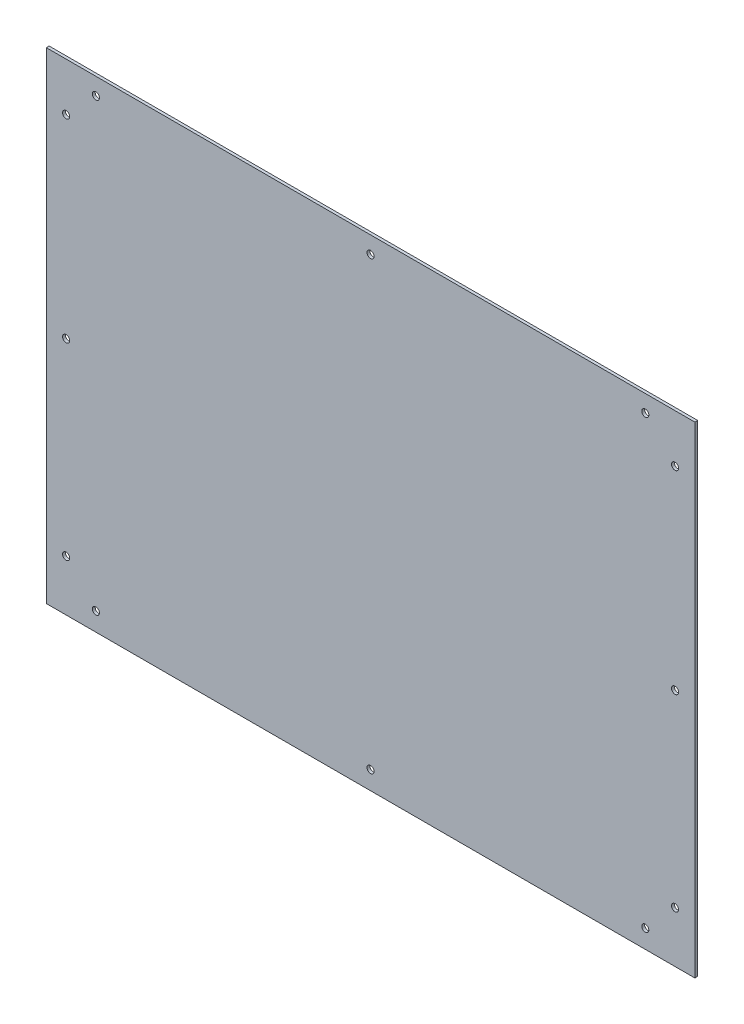
ISO-10303-21;
HEADER;
FILE_DESCRIPTION(('STEP AP214'),'2;1');
FILE_NAME('part.step','',(''),(''),'','','');
FILE_SCHEMA(('AUTOMOTIVE_DESIGN { 1 0 10303 214 1 1 1 1 }'));
ENDSEC;
DATA;
#1=APPLICATION_CONTEXT('core data for automotive mechanical design processes');
#2=APPLICATION_PROTOCOL_DEFINITION('international standard','automotive_design',2000,#1);
#3=PRODUCT_CONTEXT('',#1,'mechanical');
#4=PRODUCT('Part','Part','',(#3));
#5=PRODUCT_RELATED_PRODUCT_CATEGORY('part','',(#4));
#6=PRODUCT_DEFINITION_FORMATION('','',#4);
#7=PRODUCT_DEFINITION_CONTEXT('part definition',#1,'design');
#8=PRODUCT_DEFINITION('design','',#6,#7);
#9=PRODUCT_DEFINITION_SHAPE('','',#8);
#10=(LENGTH_UNIT() NAMED_UNIT(*) SI_UNIT(.MILLI.,.METRE.));
#11=(NAMED_UNIT(*) PLANE_ANGLE_UNIT() SI_UNIT($,.RADIAN.));
#12=(NAMED_UNIT(*) SI_UNIT($,.STERADIAN.) SOLID_ANGLE_UNIT());
#13=UNCERTAINTY_MEASURE_WITH_UNIT(LENGTH_MEASURE(1.E-05),#10,'distance_accuracy_value','');
#14=(GEOMETRIC_REPRESENTATION_CONTEXT(3) GLOBAL_UNCERTAINTY_ASSIGNED_CONTEXT((#13)) GLOBAL_UNIT_ASSIGNED_CONTEXT((#10,
#11,#12)) REPRESENTATION_CONTEXT('',''));
#15=CARTESIAN_POINT('',(0.,0.,0.));
#16=DIRECTION('',(0.,0.,1.));
#17=DIRECTION('',(1.,0.,0.));
#18=AXIS2_PLACEMENT_3D('',#15,#16,#17);
#19=CARTESIAN_POINT('',(229.,169.,2.));
#20=DIRECTION('',(-1.,0.,0.));
#21=DIRECTION('',(0.,-1.,0.));
#22=AXIS2_PLACEMENT_3D('',#19,#20,#21);
#23=PLANE('',#22);
#24=DIRECTION('',(0.,1.,0.));
#25=VECTOR('',#24,1.);
#26=CARTESIAN_POINT('',(229.,169.,0.));
#27=LINE('',#26,#25);
#28=CARTESIAN_POINT('',(229.,-169.,0.));
#29=VERTEX_POINT('',#28);
#30=CARTESIAN_POINT('',(229.,171.,0.));
#31=VERTEX_POINT('',#30);
#32=EDGE_CURVE('E174',#29,#31,#27,.T.);
#33=ORIENTED_EDGE('',*,*,#32,.T.);
#34=DIRECTION('',(0.,0.,1.));
#35=VECTOR('',#34,1.);
#36=CARTESIAN_POINT('',(229.,171.,0.));
#37=LINE('',#36,#35);
#38=CARTESIAN_POINT('',(229.,171.,2.));
#39=VERTEX_POINT('',#38);
#40=EDGE_CURVE('E96',#31,#39,#37,.T.);
#41=ORIENTED_EDGE('',*,*,#40,.T.);
#42=DIRECTION('',(0.,1.,0.));
#43=VECTOR('',#42,1.);
#44=CARTESIAN_POINT('',(229.,169.,2.));
#45=LINE('',#44,#43);
#46=CARTESIAN_POINT('',(229.,-169.,2.));
#47=VERTEX_POINT('',#46);
#48=EDGE_CURVE('E87',#47,#39,#45,.T.);
#49=ORIENTED_EDGE('',*,*,#48,.F.);
#50=DIRECTION('',(0.,0.,-1.));
#51=VECTOR('',#50,1.);
#52=CARTESIAN_POINT('',(229.,-169.,2.));
#53=LINE('',#52,#51);
#54=EDGE_CURVE('E49',#47,#29,#53,.T.);
#55=ORIENTED_EDGE('',*,*,#54,.T.);
#56=EDGE_LOOP('',(#33,#41,#49,#55));
#57=FACE_BOUND('',#56,.T.);
#58=ADVANCED_FACE('F41',(#57),#23,.F.);
#59=CARTESIAN_POINT('',(-229.,169.,2.));
#60=DIRECTION('',(1.,0.,0.));
#61=DIRECTION('',(0.,0.,-1.));
#62=AXIS2_PLACEMENT_3D('',#59,#60,#61);
#63=PLANE('',#62);
#64=DIRECTION('',(0.,-1.,0.));
#65=VECTOR('',#64,1.);
#66=CARTESIAN_POINT('',(-229.,169.,0.));
#67=LINE('',#66,#65);
#68=CARTESIAN_POINT('',(-229.,171.,0.));
#69=VERTEX_POINT('',#68);
#70=CARTESIAN_POINT('',(-229.,-169.,0.));
#71=VERTEX_POINT('',#70);
#72=EDGE_CURVE('E68',#69,#71,#67,.T.);
#73=ORIENTED_EDGE('',*,*,#72,.T.);
#74=DIRECTION('',(0.,0.,-1.));
#75=VECTOR('',#74,1.);
#76=CARTESIAN_POINT('',(-229.,-169.,2.));
#77=LINE('',#76,#75);
#78=CARTESIAN_POINT('',(-229.,-169.,2.));
#79=VERTEX_POINT('',#78);
#80=EDGE_CURVE('E11',#79,#71,#77,.T.);
#81=ORIENTED_EDGE('',*,*,#80,.F.);
#82=DIRECTION('',(0.,-1.,0.));
#83=VECTOR('',#82,1.);
#84=CARTESIAN_POINT('',(-229.,169.,2.));
#85=LINE('',#84,#83);
#86=CARTESIAN_POINT('',(-229.,171.,2.));
#87=VERTEX_POINT('',#86);
#88=EDGE_CURVE('E81',#87,#79,#85,.T.);
#89=ORIENTED_EDGE('',*,*,#88,.F.);
#90=DIRECTION('',(0.,0.,1.));
#91=VECTOR('',#90,1.);
#92=CARTESIAN_POINT('',(-229.,171.,0.));
#93=LINE('',#92,#91);
#94=EDGE_CURVE('E84',#69,#87,#93,.T.);
#95=ORIENTED_EDGE('',*,*,#94,.F.);
#96=EDGE_LOOP('',(#73,#81,#89,#95));
#97=FACE_BOUND('',#96,.T.);
#98=ADVANCED_FACE('F83',(#97),#63,.F.);
#99=CARTESIAN_POINT('',(-229.,-169.,2.));
#100=DIRECTION('',(0.,1.,0.));
#101=DIRECTION('',(0.,0.,1.));
#102=AXIS2_PLACEMENT_3D('',#99,#100,#101);
#103=PLANE('',#102);
#104=DIRECTION('',(1.,0.,0.));
#105=VECTOR('',#104,1.);
#106=CARTESIAN_POINT('',(-229.,-169.,0.));
#107=LINE('',#106,#105);
#108=EDGE_CURVE('E177',#71,#29,#107,.T.);
#109=ORIENTED_EDGE('',*,*,#108,.T.);
#110=ORIENTED_EDGE('',*,*,#54,.F.);
#111=DIRECTION('',(1.,0.,0.));
#112=VECTOR('',#111,1.);
#113=CARTESIAN_POINT('',(-229.,-169.,2.));
#114=LINE('',#113,#112);
#115=EDGE_CURVE('E57',#79,#47,#114,.T.);
#116=ORIENTED_EDGE('',*,*,#115,.F.);
#117=ORIENTED_EDGE('',*,*,#80,.T.);
#118=EDGE_LOOP('',(#109,#110,#116,#117));
#119=FACE_BOUND('',#118,.T.);
#120=ADVANCED_FACE('F187',(#119),#103,.F.);
#121=CARTESIAN_POINT('',(0.,0.,2.));
#122=DIRECTION('',(0.,0.,1.));
#123=DIRECTION('',(1.,0.,0.));
#124=AXIS2_PLACEMENT_3D('',#121,#122,#123);
#125=PLANE('',#124);
#126=CARTESIAN_POINT('',(215.,-133.,2.));
#127=DIRECTION('',(0.,0.,1.));
#128=DIRECTION('',(1.,0.,0.));
#129=AXIS2_PLACEMENT_3D('',#126,#127,#128);
#130=CIRCLE('',#129,2.50000000000002);
#131=CARTESIAN_POINT('',(217.5,-133.,2.));
#132=VERTEX_POINT('',#131);
#133=EDGE_CURVE('E142',#132,#132,#130,.T.);
#134=ORIENTED_EDGE('',*,*,#133,.F.);
#135=EDGE_LOOP('',(#134));
#136=FACE_BOUND('',#135,.T.);
#137=CARTESIAN_POINT('',(215.,0.,2.));
#138=DIRECTION('',(0.,0.,1.));
#139=DIRECTION('',(1.,0.,0.));
#140=AXIS2_PLACEMENT_3D('',#137,#138,#139);
#141=CIRCLE('',#140,2.50000000000002);
#142=CARTESIAN_POINT('',(217.5,0.,2.));
#143=VERTEX_POINT('',#142);
#144=EDGE_CURVE('E136',#143,#143,#141,.T.);
#145=ORIENTED_EDGE('',*,*,#144,.F.);
#146=EDGE_LOOP('',(#145));
#147=FACE_BOUND('',#146,.T.);
#148=CARTESIAN_POINT('',(-215.,137.,2.));
#149=DIRECTION('',(0.,0.,1.));
#150=DIRECTION('',(1.,0.,0.));
#151=AXIS2_PLACEMENT_3D('',#148,#149,#150);
#152=CIRCLE('',#151,2.49999999999997);
#153=CARTESIAN_POINT('',(-212.5,137.,2.));
#154=VERTEX_POINT('',#153);
#155=EDGE_CURVE('E130',#154,#154,#152,.T.);
#156=ORIENTED_EDGE('',*,*,#155,.F.);
#157=EDGE_LOOP('',(#156));
#158=FACE_BOUND('',#157,.T.);
#159=CARTESIAN_POINT('',(-215.,-133.,2.));
#160=DIRECTION('',(0.,0.,1.));
#161=DIRECTION('',(1.,0.,0.));
#162=AXIS2_PLACEMENT_3D('',#159,#160,#161);
#163=CIRCLE('',#162,2.49999999999935);
#164=CARTESIAN_POINT('',(-212.500000000001,-133.,2.));
#165=VERTEX_POINT('',#164);
#166=EDGE_CURVE('E123',#165,#165,#163,.T.);
#167=ORIENTED_EDGE('',*,*,#166,.F.);
#168=EDGE_LOOP('',(#167));
#169=FACE_BOUND('',#168,.T.);
#170=CARTESIAN_POINT('',(-215.,0.,2.));
#171=DIRECTION('',(0.,0.,1.));
#172=DIRECTION('',(1.,0.,0.));
#173=AXIS2_PLACEMENT_3D('',#170,#171,#172);
#174=CIRCLE('',#173,2.49999999999997);
#175=CARTESIAN_POINT('',(-212.5,0.,2.));
#176=VERTEX_POINT('',#175);
#177=EDGE_CURVE('E166',#176,#176,#174,.T.);
#178=ORIENTED_EDGE('',*,*,#177,.F.);
#179=EDGE_LOOP('',(#178));
#180=FACE_BOUND('',#179,.T.);
#181=CARTESIAN_POINT('',(194.,159.,2.));
#182=DIRECTION('',(0.,0.,1.));
#183=DIRECTION('',(1.,0.,0.));
#184=AXIS2_PLACEMENT_3D('',#181,#182,#183);
#185=CIRCLE('',#184,2.50000000000026);
#186=CARTESIAN_POINT('',(196.5,159.,2.));
#187=VERTEX_POINT('',#186);
#188=EDGE_CURVE('E160',#187,#187,#185,.T.);
#189=ORIENTED_EDGE('',*,*,#188,.F.);
#190=EDGE_LOOP('',(#189));
#191=FACE_BOUND('',#190,.T.);
#192=CARTESIAN_POINT('',(193.997422663292,-156.,2.));
#193=DIRECTION('',(0.,0.,1.));
#194=DIRECTION('',(1.,0.,0.));
#195=AXIS2_PLACEMENT_3D('',#192,#193,#194);
#196=CIRCLE('',#195,2.50000000000008);
#197=CARTESIAN_POINT('',(196.497422663292,-156.,2.));
#198=VERTEX_POINT('',#197);
#199=EDGE_CURVE('E154',#198,#198,#196,.T.);
#200=ORIENTED_EDGE('',*,*,#199,.F.);
#201=EDGE_LOOP('',(#200));
#202=FACE_BOUND('',#201,.T.);
#203=CARTESIAN_POINT('',(-194.002577336708,-156.,2.));
#204=DIRECTION('',(0.,0.,1.));
#205=DIRECTION('',(1.,0.,0.));
#206=AXIS2_PLACEMENT_3D('',#203,#204,#205);
#207=CIRCLE('',#206,2.50000000000002);
#208=CARTESIAN_POINT('',(-191.502577336708,-156.,2.));
#209=VERTEX_POINT('',#208);
#210=EDGE_CURVE('E147',#209,#209,#207,.T.);
#211=ORIENTED_EDGE('',*,*,#210,.F.);
#212=EDGE_LOOP('',(#211));
#213=FACE_BOUND('',#212,.T.);
#214=CARTESIAN_POINT('',(215.,137.,2.));
#215=DIRECTION('',(0.,0.,1.));
#216=DIRECTION('',(1.,0.,0.));
#217=AXIS2_PLACEMENT_3D('',#214,#215,#216);
#218=CIRCLE('',#217,2.50000000000002);
#219=CARTESIAN_POINT('',(217.5,137.,2.));
#220=VERTEX_POINT('',#219);
#221=EDGE_CURVE('E105',#220,#220,#218,.T.);
#222=ORIENTED_EDGE('',*,*,#221,.F.);
#223=EDGE_LOOP('',(#222));
#224=FACE_BOUND('',#223,.T.);
#225=CARTESIAN_POINT('',(0.,159.,2.));
#226=DIRECTION('',(0.,0.,1.));
#227=DIRECTION('',(1.,0.,0.));
#228=AXIS2_PLACEMENT_3D('',#225,#226,#227);
#229=CIRCLE('',#228,2.5);
#230=CARTESIAN_POINT('',(2.49999999999996,159.,2.));
#231=VERTEX_POINT('',#230);
#232=EDGE_CURVE('E112',#231,#231,#229,.T.);
#233=ORIENTED_EDGE('',*,*,#232,.F.);
#234=EDGE_LOOP('',(#233));
#235=FACE_BOUND('',#234,.T.);
#236=CARTESIAN_POINT('',(-0.00257733670794291,-156.,2.));
#237=DIRECTION('',(0.,0.,1.));
#238=DIRECTION('',(1.,0.,0.));
#239=AXIS2_PLACEMENT_3D('',#236,#237,#238);
#240=CIRCLE('',#239,2.50000000000001);
#241=CARTESIAN_POINT('',(2.49742266329207,-156.,2.));
#242=VERTEX_POINT('',#241);
#243=EDGE_CURVE('E118',#242,#242,#240,.T.);
#244=ORIENTED_EDGE('',*,*,#243,.F.);
#245=EDGE_LOOP('',(#244));
#246=FACE_BOUND('',#245,.T.);
#247=CARTESIAN_POINT('',(-194.,159.,2.));
#248=DIRECTION('',(0.,0.,1.));
#249=DIRECTION('',(1.,0.,0.));
#250=AXIS2_PLACEMENT_3D('',#247,#248,#249);
#251=CIRCLE('',#250,2.49999999999997);
#252=CARTESIAN_POINT('',(-191.5,159.,2.));
#253=VERTEX_POINT('',#252);
#254=EDGE_CURVE('E150',#253,#253,#251,.T.);
#255=ORIENTED_EDGE('',*,*,#254,.F.);
#256=EDGE_LOOP('',(#255));
#257=FACE_BOUND('',#256,.T.);
#258=ORIENTED_EDGE('',*,*,#48,.T.);
#259=DIRECTION('',(-1.,0.,0.));
#260=VECTOR('',#259,1.);
#261=CARTESIAN_POINT('',(-229.,171.,2.));
#262=LINE('',#261,#260);
#263=EDGE_CURVE('E93',#39,#87,#262,.T.);
#264=ORIENTED_EDGE('',*,*,#263,.T.);
#265=ORIENTED_EDGE('',*,*,#88,.T.);
#266=ORIENTED_EDGE('',*,*,#115,.T.);
#267=EDGE_LOOP('',(#258,#264,#265,#266));
#268=FACE_BOUND('',#267,.T.);
#269=ADVANCED_FACE('F98',(#136,#147,#158,#169,#180,#191,#202,#213,#224,#235,#246,#257,#268),
#125,.T.);
#270=CARTESIAN_POINT('',(0.,0.,0.));
#271=DIRECTION('',(0.,0.,1.));
#272=DIRECTION('',(1.,0.,0.));
#273=AXIS2_PLACEMENT_3D('',#270,#271,#272);
#274=PLANE('',#273);
#275=CARTESIAN_POINT('',(215.,-133.,0.));
#276=DIRECTION('',(0.,0.,1.));
#277=DIRECTION('',(1.,0.,0.));
#278=AXIS2_PLACEMENT_3D('',#275,#276,#277);
#279=CIRCLE('',#278,2.50000000000002);
#280=CARTESIAN_POINT('',(217.5,-133.,0.));
#281=VERTEX_POINT('',#280);
#282=EDGE_CURVE('E108',#281,#281,#279,.T.);
#283=ORIENTED_EDGE('',*,*,#282,.T.);
#284=EDGE_LOOP('',(#283));
#285=FACE_BOUND('',#284,.T.);
#286=CARTESIAN_POINT('',(215.,0.,0.));
#287=DIRECTION('',(0.,0.,1.));
#288=DIRECTION('',(1.,0.,0.));
#289=AXIS2_PLACEMENT_3D('',#286,#287,#288);
#290=CIRCLE('',#289,2.50000000000002);
#291=CARTESIAN_POINT('',(217.5,0.,0.));
#292=VERTEX_POINT('',#291);
#293=EDGE_CURVE('E139',#292,#292,#290,.T.);
#294=ORIENTED_EDGE('',*,*,#293,.T.);
#295=EDGE_LOOP('',(#294));
#296=FACE_BOUND('',#295,.T.);
#297=CARTESIAN_POINT('',(-215.,137.,0.));
#298=DIRECTION('',(0.,0.,1.));
#299=DIRECTION('',(1.,0.,0.));
#300=AXIS2_PLACEMENT_3D('',#297,#298,#299);
#301=CIRCLE('',#300,2.49999999999997);
#302=CARTESIAN_POINT('',(-212.5,137.,0.));
#303=VERTEX_POINT('',#302);
#304=EDGE_CURVE('E133',#303,#303,#301,.T.);
#305=ORIENTED_EDGE('',*,*,#304,.T.);
#306=EDGE_LOOP('',(#305));
#307=FACE_BOUND('',#306,.T.);
#308=CARTESIAN_POINT('',(-215.,-133.,0.));
#309=DIRECTION('',(0.,0.,1.));
#310=DIRECTION('',(1.,0.,0.));
#311=AXIS2_PLACEMENT_3D('',#308,#309,#310);
#312=CIRCLE('',#311,2.49999999999935);
#313=CARTESIAN_POINT('',(-212.500000000001,-133.,0.));
#314=VERTEX_POINT('',#313);
#315=EDGE_CURVE('E127',#314,#314,#312,.T.);
#316=ORIENTED_EDGE('',*,*,#315,.T.);
#317=EDGE_LOOP('',(#316));
#318=FACE_BOUND('',#317,.T.);
#319=CARTESIAN_POINT('',(-215.,0.,0.));
#320=DIRECTION('',(0.,0.,1.));
#321=DIRECTION('',(1.,0.,0.));
#322=AXIS2_PLACEMENT_3D('',#319,#320,#321);
#323=CIRCLE('',#322,2.49999999999997);
#324=CARTESIAN_POINT('',(-212.5,0.,0.));
#325=VERTEX_POINT('',#324);
#326=EDGE_CURVE('E126',#325,#325,#323,.T.);
#327=ORIENTED_EDGE('',*,*,#326,.T.);
#328=EDGE_LOOP('',(#327));
#329=FACE_BOUND('',#328,.T.);
#330=CARTESIAN_POINT('',(194.,159.,0.));
#331=DIRECTION('',(0.,0.,1.));
#332=DIRECTION('',(1.,0.,0.));
#333=AXIS2_PLACEMENT_3D('',#330,#331,#332);
#334=CIRCLE('',#333,2.50000000000026);
#335=CARTESIAN_POINT('',(196.5,159.,0.));
#336=VERTEX_POINT('',#335);
#337=EDGE_CURVE('E163',#336,#336,#334,.T.);
#338=ORIENTED_EDGE('',*,*,#337,.T.);
#339=EDGE_LOOP('',(#338));
#340=FACE_BOUND('',#339,.T.);
#341=CARTESIAN_POINT('',(193.997422663292,-156.,0.));
#342=DIRECTION('',(0.,0.,1.));
#343=DIRECTION('',(1.,0.,0.));
#344=AXIS2_PLACEMENT_3D('',#341,#342,#343);
#345=CIRCLE('',#344,2.50000000000008);
#346=CARTESIAN_POINT('',(196.497422663292,-156.,0.));
#347=VERTEX_POINT('',#346);
#348=EDGE_CURVE('E157',#347,#347,#345,.T.);
#349=ORIENTED_EDGE('',*,*,#348,.T.);
#350=EDGE_LOOP('',(#349));
#351=FACE_BOUND('',#350,.T.);
#352=CARTESIAN_POINT('',(-194.002577336708,-156.,0.));
#353=DIRECTION('',(0.,0.,1.));
#354=DIRECTION('',(1.,0.,0.));
#355=AXIS2_PLACEMENT_3D('',#352,#353,#354);
#356=CIRCLE('',#355,2.50000000000002);
#357=CARTESIAN_POINT('',(-191.502577336708,-156.,0.));
#358=VERTEX_POINT('',#357);
#359=EDGE_CURVE('E151',#358,#358,#356,.T.);
#360=ORIENTED_EDGE('',*,*,#359,.T.);
#361=EDGE_LOOP('',(#360));
#362=FACE_BOUND('',#361,.T.);
#363=CARTESIAN_POINT('',(215.,137.,0.));
#364=DIRECTION('',(0.,0.,1.));
#365=DIRECTION('',(1.,0.,0.));
#366=AXIS2_PLACEMENT_3D('',#363,#364,#365);
#367=CIRCLE('',#366,2.50000000000002);
#368=CARTESIAN_POINT('',(217.5,137.,0.));
#369=VERTEX_POINT('',#368);
#370=EDGE_CURVE('E109',#369,#369,#367,.T.);
#371=ORIENTED_EDGE('',*,*,#370,.T.);
#372=EDGE_LOOP('',(#371));
#373=FACE_BOUND('',#372,.T.);
#374=CARTESIAN_POINT('',(0.,159.,0.));
#375=DIRECTION('',(0.,0.,1.));
#376=DIRECTION('',(1.,0.,0.));
#377=AXIS2_PLACEMENT_3D('',#374,#375,#376);
#378=CIRCLE('',#377,2.5);
#379=CARTESIAN_POINT('',(2.49999999999996,159.,0.));
#380=VERTEX_POINT('',#379);
#381=EDGE_CURVE('E115',#380,#380,#378,.T.);
#382=ORIENTED_EDGE('',*,*,#381,.T.);
#383=EDGE_LOOP('',(#382));
#384=FACE_BOUND('',#383,.T.);
#385=CARTESIAN_POINT('',(-0.00257733670794291,-156.,0.));
#386=DIRECTION('',(0.,0.,1.));
#387=DIRECTION('',(1.,0.,0.));
#388=AXIS2_PLACEMENT_3D('',#385,#386,#387);
#389=CIRCLE('',#388,2.50000000000001);
#390=CARTESIAN_POINT('',(2.49742266329207,-156.,0.));
#391=VERTEX_POINT('',#390);
#392=EDGE_CURVE('E95',#391,#391,#389,.T.);
#393=ORIENTED_EDGE('',*,*,#392,.T.);
#394=EDGE_LOOP('',(#393));
#395=FACE_BOUND('',#394,.T.);
#396=CARTESIAN_POINT('',(-194.,159.,0.));
#397=DIRECTION('',(0.,0.,1.));
#398=DIRECTION('',(1.,0.,0.));
#399=AXIS2_PLACEMENT_3D('',#396,#397,#398);
#400=CIRCLE('',#399,2.49999999999997);
#401=CARTESIAN_POINT('',(-191.5,159.,0.));
#402=VERTEX_POINT('',#401);
#403=EDGE_CURVE('E171',#402,#402,#400,.T.);
#404=ORIENTED_EDGE('',*,*,#403,.T.);
#405=EDGE_LOOP('',(#404));
#406=FACE_BOUND('',#405,.T.);
#407=ORIENTED_EDGE('',*,*,#32,.F.);
#408=ORIENTED_EDGE('',*,*,#108,.F.);
#409=ORIENTED_EDGE('',*,*,#72,.F.);
#410=DIRECTION('',(-1.,0.,0.));
#411=VECTOR('',#410,1.);
#412=CARTESIAN_POINT('',(-229.,171.,0.));
#413=LINE('',#412,#411);
#414=EDGE_CURVE('E94',#31,#69,#413,.T.);
#415=ORIENTED_EDGE('',*,*,#414,.F.);
#416=EDGE_LOOP('',(#407,#408,#409,#415));
#417=FACE_BOUND('',#416,.T.);
#418=ADVANCED_FACE('F186',(#285,#296,#307,#318,#329,#340,#351,#362,#373,#384,#395,#406,#417),
#274,.F.);
#419=CARTESIAN_POINT('',(-194.,159.,0.));
#420=DIRECTION('',(0.,0.,1.));
#421=DIRECTION('',(1.,0.,0.));
#422=AXIS2_PLACEMENT_3D('',#419,#420,#421);
#423=CYLINDRICAL_SURFACE('',#422,2.49999999999997);
#424=ORIENTED_EDGE('',*,*,#403,.F.);
#425=EDGE_LOOP('',(#424));
#426=FACE_BOUND('',#425,.T.);
#427=ORIENTED_EDGE('',*,*,#254,.T.);
#428=EDGE_LOOP('',(#427));
#429=FACE_BOUND('',#428,.T.);
#430=ADVANCED_FACE('F222',(#426,#429),#423,.F.);
#431=CARTESIAN_POINT('',(-0.00257733670794291,-156.,0.));
#432=DIRECTION('',(0.,0.,1.));
#433=DIRECTION('',(1.,0.,0.));
#434=AXIS2_PLACEMENT_3D('',#431,#432,#433);
#435=CYLINDRICAL_SURFACE('',#434,2.50000000000001);
#436=ORIENTED_EDGE('',*,*,#392,.F.);
#437=EDGE_LOOP('',(#436));
#438=FACE_BOUND('',#437,.T.);
#439=ORIENTED_EDGE('',*,*,#243,.T.);
#440=EDGE_LOOP('',(#439));
#441=FACE_BOUND('',#440,.T.);
#442=ADVANCED_FACE('F313',(#438,#441),#435,.F.);
#443=CARTESIAN_POINT('',(0.,159.,0.));
#444=DIRECTION('',(0.,0.,1.));
#445=DIRECTION('',(1.,0.,0.));
#446=AXIS2_PLACEMENT_3D('',#443,#444,#445);
#447=CYLINDRICAL_SURFACE('',#446,2.5);
#448=ORIENTED_EDGE('',*,*,#381,.F.);
#449=EDGE_LOOP('',(#448));
#450=FACE_BOUND('',#449,.T.);
#451=ORIENTED_EDGE('',*,*,#232,.T.);
#452=EDGE_LOOP('',(#451));
#453=FACE_BOUND('',#452,.T.);
#454=ADVANCED_FACE('F305',(#450,#453),#447,.F.);
#455=CARTESIAN_POINT('',(215.,137.,0.));
#456=DIRECTION('',(0.,0.,1.));
#457=DIRECTION('',(1.,0.,0.));
#458=AXIS2_PLACEMENT_3D('',#455,#456,#457);
#459=CYLINDRICAL_SURFACE('',#458,2.50000000000002);
#460=ORIENTED_EDGE('',*,*,#370,.F.);
#461=EDGE_LOOP('',(#460));
#462=FACE_BOUND('',#461,.T.);
#463=ORIENTED_EDGE('',*,*,#221,.T.);
#464=EDGE_LOOP('',(#463));
#465=FACE_BOUND('',#464,.T.);
#466=ADVANCED_FACE('F297',(#462,#465),#459,.F.);
#467=CARTESIAN_POINT('',(-194.002577336708,-156.,0.));
#468=DIRECTION('',(0.,0.,1.));
#469=DIRECTION('',(1.,0.,0.));
#470=AXIS2_PLACEMENT_3D('',#467,#468,#469);
#471=CYLINDRICAL_SURFACE('',#470,2.50000000000002);
#472=ORIENTED_EDGE('',*,*,#359,.F.);
#473=EDGE_LOOP('',(#472));
#474=FACE_BOUND('',#473,.T.);
#475=ORIENTED_EDGE('',*,*,#210,.T.);
#476=EDGE_LOOP('',(#475));
#477=FACE_BOUND('',#476,.T.);
#478=ADVANCED_FACE('F289',(#474,#477),#471,.F.);
#479=CARTESIAN_POINT('',(193.997422663292,-156.,0.));
#480=DIRECTION('',(0.,0.,1.));
#481=DIRECTION('',(1.,0.,0.));
#482=AXIS2_PLACEMENT_3D('',#479,#480,#481);
#483=CYLINDRICAL_SURFACE('',#482,2.50000000000008);
#484=ORIENTED_EDGE('',*,*,#348,.F.);
#485=EDGE_LOOP('',(#484));
#486=FACE_BOUND('',#485,.T.);
#487=ORIENTED_EDGE('',*,*,#199,.T.);
#488=EDGE_LOOP('',(#487));
#489=FACE_BOUND('',#488,.T.);
#490=ADVANCED_FACE('F281',(#486,#489),#483,.F.);
#491=CARTESIAN_POINT('',(194.,159.,0.));
#492=DIRECTION('',(0.,0.,1.));
#493=DIRECTION('',(1.,0.,0.));
#494=AXIS2_PLACEMENT_3D('',#491,#492,#493);
#495=CYLINDRICAL_SURFACE('',#494,2.50000000000026);
#496=ORIENTED_EDGE('',*,*,#337,.F.);
#497=EDGE_LOOP('',(#496));
#498=FACE_BOUND('',#497,.T.);
#499=ORIENTED_EDGE('',*,*,#188,.T.);
#500=EDGE_LOOP('',(#499));
#501=FACE_BOUND('',#500,.T.);
#502=ADVANCED_FACE('F273',(#498,#501),#495,.F.);
#503=CARTESIAN_POINT('',(-215.,0.,0.));
#504=DIRECTION('',(0.,0.,1.));
#505=DIRECTION('',(1.,0.,0.));
#506=AXIS2_PLACEMENT_3D('',#503,#504,#505);
#507=CYLINDRICAL_SURFACE('',#506,2.49999999999997);
#508=ORIENTED_EDGE('',*,*,#326,.F.);
#509=EDGE_LOOP('',(#508));
#510=FACE_BOUND('',#509,.T.);
#511=ORIENTED_EDGE('',*,*,#177,.T.);
#512=EDGE_LOOP('',(#511));
#513=FACE_BOUND('',#512,.T.);
#514=ADVANCED_FACE('F265',(#510,#513),#507,.F.);
#515=CARTESIAN_POINT('',(-215.,-133.,0.));
#516=DIRECTION('',(0.,0.,1.));
#517=DIRECTION('',(1.,0.,0.));
#518=AXIS2_PLACEMENT_3D('',#515,#516,#517);
#519=CYLINDRICAL_SURFACE('',#518,2.49999999999935);
#520=ORIENTED_EDGE('',*,*,#315,.F.);
#521=EDGE_LOOP('',(#520));
#522=FACE_BOUND('',#521,.T.);
#523=ORIENTED_EDGE('',*,*,#166,.T.);
#524=EDGE_LOOP('',(#523));
#525=FACE_BOUND('',#524,.T.);
#526=ADVANCED_FACE('F257',(#522,#525),#519,.F.);
#527=CARTESIAN_POINT('',(-215.,137.,0.));
#528=DIRECTION('',(0.,0.,1.));
#529=DIRECTION('',(1.,0.,0.));
#530=AXIS2_PLACEMENT_3D('',#527,#528,#529);
#531=CYLINDRICAL_SURFACE('',#530,2.49999999999997);
#532=ORIENTED_EDGE('',*,*,#304,.F.);
#533=EDGE_LOOP('',(#532));
#534=FACE_BOUND('',#533,.T.);
#535=ORIENTED_EDGE('',*,*,#155,.T.);
#536=EDGE_LOOP('',(#535));
#537=FACE_BOUND('',#536,.T.);
#538=ADVANCED_FACE('F249',(#534,#537),#531,.F.);
#539=CARTESIAN_POINT('',(215.,0.,0.));
#540=DIRECTION('',(0.,0.,1.));
#541=DIRECTION('',(1.,0.,0.));
#542=AXIS2_PLACEMENT_3D('',#539,#540,#541);
#543=CYLINDRICAL_SURFACE('',#542,2.50000000000002);
#544=ORIENTED_EDGE('',*,*,#293,.F.);
#545=EDGE_LOOP('',(#544));
#546=FACE_BOUND('',#545,.T.);
#547=ORIENTED_EDGE('',*,*,#144,.T.);
#548=EDGE_LOOP('',(#547));
#549=FACE_BOUND('',#548,.T.);
#550=ADVANCED_FACE('F241',(#546,#549),#543,.F.);
#551=CARTESIAN_POINT('',(215.,-133.,0.));
#552=DIRECTION('',(0.,0.,1.));
#553=DIRECTION('',(1.,0.,0.));
#554=AXIS2_PLACEMENT_3D('',#551,#552,#553);
#555=CYLINDRICAL_SURFACE('',#554,2.50000000000002);
#556=ORIENTED_EDGE('',*,*,#282,.F.);
#557=EDGE_LOOP('',(#556));
#558=FACE_BOUND('',#557,.T.);
#559=ORIENTED_EDGE('',*,*,#133,.T.);
#560=EDGE_LOOP('',(#559));
#561=FACE_BOUND('',#560,.T.);
#562=ADVANCED_FACE('F232',(#558,#561),#555,.F.);
#563=CARTESIAN_POINT('',(-229.,171.,0.));
#564=DIRECTION('',(0.,1.,0.));
#565=DIRECTION('',(0.,0.,1.));
#566=AXIS2_PLACEMENT_3D('',#563,#564,#565);
#567=PLANE('',#566);
#568=ORIENTED_EDGE('',*,*,#263,.F.);
#569=ORIENTED_EDGE('',*,*,#40,.F.);
#570=ORIENTED_EDGE('',*,*,#414,.T.);
#571=ORIENTED_EDGE('',*,*,#94,.T.);
#572=EDGE_LOOP('',(#568,#569,#570,#571));
#573=FACE_BOUND('',#572,.T.);
#574=ADVANCED_FACE('F91',(#573),#567,.T.);
#575=CLOSED_SHELL('',(#58,#98,#120,#269,#418,#430,#442,#454,#466,#478,#490,#502,#514,#526,#538,
#550,#562,#574));
#576=MANIFOLD_SOLID_BREP('B2',#575);
#577=ADVANCED_BREP_SHAPE_REPRESENTATION('',(#18,#576),#14);
#578=SHAPE_DEFINITION_REPRESENTATION(#9,#577);
ENDSEC;
END-ISO-10303-21;
